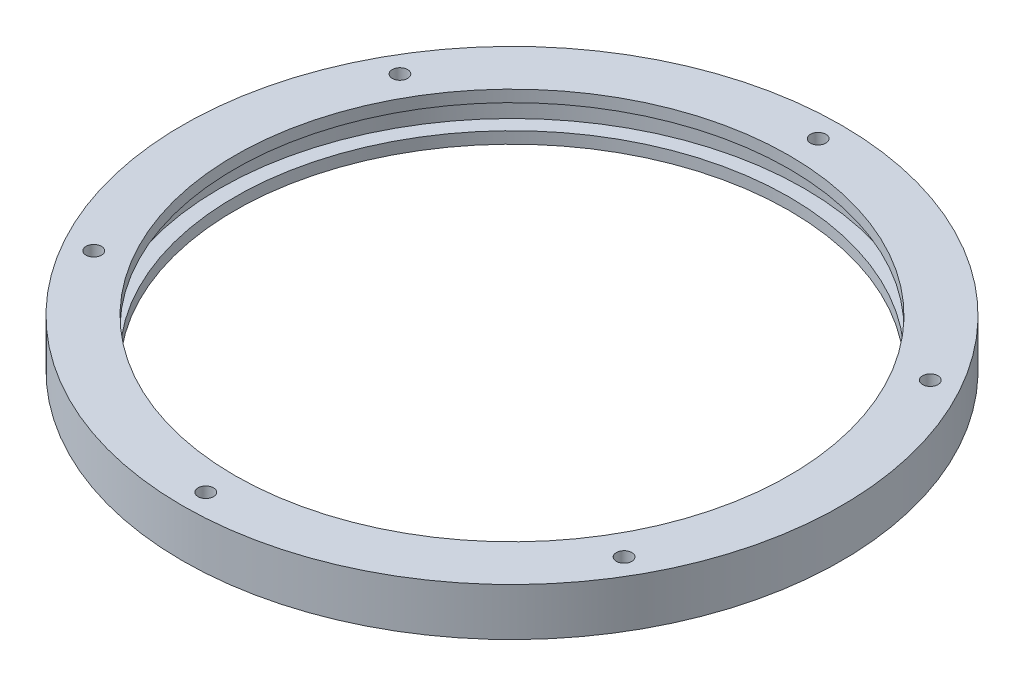
ISO-10303-21;
HEADER;
FILE_DESCRIPTION(('STEP AP214'),'2;1');
FILE_NAME('part.step','',(''),(''),'','','');
FILE_SCHEMA(('AUTOMOTIVE_DESIGN { 1 0 10303 214 1 1 1 1 }'));
ENDSEC;
DATA;
#1=APPLICATION_CONTEXT('core data for automotive mechanical design processes');
#2=APPLICATION_PROTOCOL_DEFINITION('international standard','automotive_design',2000,#1);
#3=PRODUCT_CONTEXT('',#1,'mechanical');
#4=PRODUCT('Part','Part','',(#3));
#5=PRODUCT_RELATED_PRODUCT_CATEGORY('part','',(#4));
#6=PRODUCT_DEFINITION_FORMATION('','',#4);
#7=PRODUCT_DEFINITION_CONTEXT('part definition',#1,'design');
#8=PRODUCT_DEFINITION('design','',#6,#7);
#9=PRODUCT_DEFINITION_SHAPE('','',#8);
#10=(LENGTH_UNIT() NAMED_UNIT(*) SI_UNIT(.MILLI.,.METRE.));
#11=(NAMED_UNIT(*) PLANE_ANGLE_UNIT() SI_UNIT($,.RADIAN.));
#12=(NAMED_UNIT(*) SI_UNIT($,.STERADIAN.) SOLID_ANGLE_UNIT());
#13=UNCERTAINTY_MEASURE_WITH_UNIT(LENGTH_MEASURE(1.E-05),#10,'distance_accuracy_value','');
#14=(GEOMETRIC_REPRESENTATION_CONTEXT(3) GLOBAL_UNCERTAINTY_ASSIGNED_CONTEXT((#13)) GLOBAL_UNIT_ASSIGNED_CONTEXT((#10,
#11,#12)) REPRESENTATION_CONTEXT('',''));
#15=CARTESIAN_POINT('',(0.,0.,0.));
#16=DIRECTION('',(0.,0.,1.));
#17=DIRECTION('',(1.,0.,0.));
#18=AXIS2_PLACEMENT_3D('',#15,#16,#17);
#19=CARTESIAN_POINT('',(70.5,0.,0.));
#20=DIRECTION('',(0.,-1.,0.));
#21=DIRECTION('',(0.,0.,-1.));
#22=AXIS2_PLACEMENT_3D('',#19,#20,#21);
#23=PLANE('',#22);
#24=CARTESIAN_POINT('',(0.,0.,0.));
#25=DIRECTION('',(0.,-1.,0.));
#26=DIRECTION('',(0.,0.,-1.));
#27=AXIS2_PLACEMENT_3D('',#24,#25,#26);
#28=CIRCLE('',#27,70.5);
#29=CARTESIAN_POINT('',(0.,0.,-70.5));
#30=VERTEX_POINT('',#29);
#31=EDGE_CURVE('E108',#30,#30,#28,.T.);
#32=ORIENTED_EDGE('',*,*,#31,.T.);
#33=EDGE_LOOP('',(#32));
#34=FACE_BOUND('',#33,.T.);
#35=CARTESIAN_POINT('',(0.,0.,0.));
#36=DIRECTION('',(0.,-1.,0.));
#37=DIRECTION('',(0.,0.,-1.));
#38=AXIS2_PLACEMENT_3D('',#35,#36,#37);
#39=CIRCLE('',#38,59.3);
#40=CARTESIAN_POINT('',(0.,0.,-59.3));
#41=VERTEX_POINT('',#40);
#42=EDGE_CURVE('E11',#41,#41,#39,.T.);
#43=ORIENTED_EDGE('',*,*,#42,.F.);
#44=EDGE_LOOP('',(#43));
#45=FACE_BOUND('',#44,.T.);
#46=ADVANCED_FACE('F38',(#34,#45),#23,.T.);
#47=CARTESIAN_POINT('',(0.,5.09999999999999,0.));
#48=DIRECTION('',(0.,-1.,0.));
#49=DIRECTION('',(0.,0.,-1.));
#50=AXIS2_PLACEMENT_3D('',#47,#48,#49);
#51=CYLINDRICAL_SURFACE('',#50,59.3);
#52=ORIENTED_EDGE('',*,*,#42,.T.);
#53=EDGE_LOOP('',(#52));
#54=FACE_BOUND('',#53,.T.);
#55=CARTESIAN_POINT('',(0.,2.5,0.));
#56=DIRECTION('',(0.,-1.,0.));
#57=DIRECTION('',(0.,0.,-1.));
#58=AXIS2_PLACEMENT_3D('',#55,#56,#57);
#59=CIRCLE('',#58,59.3);
#60=CARTESIAN_POINT('',(0.,2.5,-59.3));
#61=VERTEX_POINT('',#60);
#62=EDGE_CURVE('E45',#61,#61,#59,.T.);
#63=ORIENTED_EDGE('',*,*,#62,.F.);
#64=EDGE_LOOP('',(#63));
#65=FACE_BOUND('',#64,.T.);
#66=ADVANCED_FACE('F131',(#54,#65),#51,.F.);
#67=CARTESIAN_POINT('',(59.3,2.5,0.));
#68=DIRECTION('',(0.,1.,0.));
#69=DIRECTION('',(0.,0.,1.));
#70=AXIS2_PLACEMENT_3D('',#67,#68,#69);
#71=PLANE('',#70);
#72=ORIENTED_EDGE('',*,*,#62,.T.);
#73=EDGE_LOOP('',(#72));
#74=FACE_BOUND('',#73,.T.);
#75=CARTESIAN_POINT('',(0.,2.5,0.));
#76=DIRECTION('',(0.,-1.,0.));
#77=DIRECTION('',(0.,0.,-1.));
#78=AXIS2_PLACEMENT_3D('',#75,#76,#77);
#79=CIRCLE('',#78,62.5);
#80=CARTESIAN_POINT('',(0.,2.5,-62.5));
#81=VERTEX_POINT('',#80);
#82=EDGE_CURVE('E123',#81,#81,#79,.T.);
#83=ORIENTED_EDGE('',*,*,#82,.F.);
#84=EDGE_LOOP('',(#83));
#85=FACE_BOUND('',#84,.T.);
#86=ADVANCED_FACE('F128',(#74,#85),#71,.T.);
#87=CARTESIAN_POINT('',(0.,5.09999999999999,0.));
#88=DIRECTION('',(0.,-1.,0.));
#89=DIRECTION('',(0.,0.,-1.));
#90=AXIS2_PLACEMENT_3D('',#87,#88,#89);
#91=CYLINDRICAL_SURFACE('',#90,62.5);
#92=ORIENTED_EDGE('',*,*,#82,.T.);
#93=EDGE_LOOP('',(#92));
#94=FACE_BOUND('',#93,.T.);
#95=CARTESIAN_POINT('',(0.,7.7,0.));
#96=DIRECTION('',(0.,-1.,0.));
#97=DIRECTION('',(0.,0.,-1.));
#98=AXIS2_PLACEMENT_3D('',#95,#96,#97);
#99=CIRCLE('',#98,62.5);
#100=CARTESIAN_POINT('',(0.,7.7,-62.5));
#101=VERTEX_POINT('',#100);
#102=EDGE_CURVE('E120',#101,#101,#99,.T.);
#103=ORIENTED_EDGE('',*,*,#102,.F.);
#104=EDGE_LOOP('',(#103));
#105=FACE_BOUND('',#104,.T.);
#106=ADVANCED_FACE('F138',(#94,#105),#91,.F.);
#107=CARTESIAN_POINT('',(62.5,7.7,0.));
#108=DIRECTION('',(0.,-1.,0.));
#109=DIRECTION('',(0.,0.,-1.));
#110=AXIS2_PLACEMENT_3D('',#107,#108,#109);
#111=PLANE('',#110);
#112=ORIENTED_EDGE('',*,*,#102,.T.);
#113=EDGE_LOOP('',(#112));
#114=FACE_BOUND('',#113,.T.);
#115=CARTESIAN_POINT('',(0.,7.7,0.));
#116=DIRECTION('',(0.,-1.,0.));
#117=DIRECTION('',(0.,0.,-1.));
#118=AXIS2_PLACEMENT_3D('',#115,#116,#117);
#119=CIRCLE('',#118,59.3);
#120=CARTESIAN_POINT('',(0.,7.7,-59.3));
#121=VERTEX_POINT('',#120);
#122=EDGE_CURVE('E117',#121,#121,#119,.T.);
#123=ORIENTED_EDGE('',*,*,#122,.F.);
#124=EDGE_LOOP('',(#123));
#125=FACE_BOUND('',#124,.T.);
#126=ADVANCED_FACE('F144',(#114,#125),#111,.T.);
#127=CARTESIAN_POINT('',(0.,5.09999999999999,0.));
#128=DIRECTION('',(0.,-1.,0.));
#129=DIRECTION('',(0.,0.,-1.));
#130=AXIS2_PLACEMENT_3D('',#127,#128,#129);
#131=CYLINDRICAL_SURFACE('',#130,59.3);
#132=ORIENTED_EDGE('',*,*,#122,.T.);
#133=EDGE_LOOP('',(#132));
#134=FACE_BOUND('',#133,.T.);
#135=CARTESIAN_POINT('',(0.,10.2,0.));
#136=DIRECTION('',(0.,-1.,0.));
#137=DIRECTION('',(0.,0.,-1.));
#138=AXIS2_PLACEMENT_3D('',#135,#136,#137);
#139=CIRCLE('',#138,59.3);
#140=CARTESIAN_POINT('',(0.,10.2,-59.3));
#141=VERTEX_POINT('',#140);
#142=EDGE_CURVE('E114',#141,#141,#139,.T.);
#143=ORIENTED_EDGE('',*,*,#142,.F.);
#144=EDGE_LOOP('',(#143));
#145=FACE_BOUND('',#144,.T.);
#146=ADVANCED_FACE('F148',(#134,#145),#131,.F.);
#147=CARTESIAN_POINT('',(59.3,10.2,0.));
#148=DIRECTION('',(0.,1.,0.));
#149=DIRECTION('',(0.,0.,1.));
#150=AXIS2_PLACEMENT_3D('',#147,#148,#149);
#151=PLANE('',#150);
#152=CARTESIAN_POINT('',(-56.7246639478804,10.2,-32.7500000000007));
#153=DIRECTION('',(0.,1.,0.));
#154=DIRECTION('',(0.866025403784433,0.,0.50000000000001));
#155=AXIS2_PLACEMENT_3D('',#152,#153,#154);
#156=CIRCLE('',#155,1.64999999999999);
#157=CARTESIAN_POINT('',(-55.295722031636,10.2,-31.9250000000006));
#158=VERTEX_POINT('',#157);
#159=EDGE_CURVE('E91',#158,#158,#156,.T.);
#160=ORIENTED_EDGE('',*,*,#159,.F.);
#161=EDGE_LOOP('',(#160));
#162=FACE_BOUND('',#161,.T.);
#163=CARTESIAN_POINT('',(-56.724663947881,10.2,32.7499999999995));
#164=DIRECTION('',(0.,1.,0.));
#165=DIRECTION('',(0.866025403784443,0.,-0.499999999999992));
#166=AXIS2_PLACEMENT_3D('',#163,#164,#165);
#167=CIRCLE('',#166,1.64999999999999);
#168=CARTESIAN_POINT('',(-55.2957220316367,10.2,31.9249999999995));
#169=VERTEX_POINT('',#168);
#170=EDGE_CURVE('E85',#169,#169,#167,.T.);
#171=ORIENTED_EDGE('',*,*,#170,.F.);
#172=EDGE_LOOP('',(#171));
#173=FACE_BOUND('',#172,.T.);
#174=CARTESIAN_POINT('',(0.,10.2,65.5));
#175=DIRECTION('',(0.,1.,0.));
#176=DIRECTION('',(0.,0.,-1.));
#177=AXIS2_PLACEMENT_3D('',#174,#175,#176);
#178=CIRCLE('',#177,1.64999999999999);
#179=CARTESIAN_POINT('',(0.,10.2,63.85));
#180=VERTEX_POINT('',#179);
#181=EDGE_CURVE('E75',#180,#180,#178,.T.);
#182=ORIENTED_EDGE('',*,*,#181,.F.);
#183=EDGE_LOOP('',(#182));
#184=FACE_BOUND('',#183,.T.);
#185=CARTESIAN_POINT('',(56.7246639478806,10.2,32.7500000000003));
#186=DIRECTION('',(0.,1.,0.));
#187=DIRECTION('',(-0.866025403784436,0.,-0.500000000000004));
#188=AXIS2_PLACEMENT_3D('',#185,#186,#187);
#189=CIRCLE('',#188,1.64999999999999);
#190=CARTESIAN_POINT('',(55.2957220316363,10.2,31.9250000000003));
#191=VERTEX_POINT('',#190);
#192=EDGE_CURVE('E74',#191,#191,#189,.T.);
#193=ORIENTED_EDGE('',*,*,#192,.F.);
#194=EDGE_LOOP('',(#193));
#195=FACE_BOUND('',#194,.T.);
#196=CARTESIAN_POINT('',(56.7246639478808,10.2,-32.7499999999999));
#197=DIRECTION('',(0.,1.,0.));
#198=DIRECTION('',(-0.86602540378444,0.,0.499999999999998));
#199=AXIS2_PLACEMENT_3D('',#196,#197,#198);
#200=CIRCLE('',#199,1.64999999999999);
#201=CARTESIAN_POINT('',(55.2957220316365,10.2,-31.9249999999999));
#202=VERTEX_POINT('',#201);
#203=EDGE_CURVE('E96',#202,#202,#200,.T.);
#204=ORIENTED_EDGE('',*,*,#203,.F.);
#205=EDGE_LOOP('',(#204));
#206=FACE_BOUND('',#205,.T.);
#207=CARTESIAN_POINT('',(0.,10.2,-65.5));
#208=DIRECTION('',(0.,1.,0.));
#209=DIRECTION('',(0.,0.,1.));
#210=AXIS2_PLACEMENT_3D('',#207,#208,#209);
#211=CIRCLE('',#210,1.64999999999999);
#212=CARTESIAN_POINT('',(0.,10.2,-63.85));
#213=VERTEX_POINT('',#212);
#214=EDGE_CURVE('E102',#213,#213,#211,.T.);
#215=ORIENTED_EDGE('',*,*,#214,.F.);
#216=EDGE_LOOP('',(#215));
#217=FACE_BOUND('',#216,.T.);
#218=ORIENTED_EDGE('',*,*,#142,.T.);
#219=EDGE_LOOP('',(#218));
#220=FACE_BOUND('',#219,.T.);
#221=CARTESIAN_POINT('',(0.,10.2,0.));
#222=DIRECTION('',(0.,-1.,0.));
#223=DIRECTION('',(0.,0.,-1.));
#224=AXIS2_PLACEMENT_3D('',#221,#222,#223);
#225=CIRCLE('',#224,70.5);
#226=CARTESIAN_POINT('',(0.,10.2,-70.5));
#227=VERTEX_POINT('',#226);
#228=EDGE_CURVE('E111',#227,#227,#225,.T.);
#229=ORIENTED_EDGE('',*,*,#228,.F.);
#230=EDGE_LOOP('',(#229));
#231=FACE_BOUND('',#230,.T.);
#232=ADVANCED_FACE('F152',(#162,#173,#184,#195,#206,#217,#220,#231),#151,.T.);
#233=CARTESIAN_POINT('',(0.,5.09999999999999,0.));
#234=DIRECTION('',(0.,-1.,0.));
#235=DIRECTION('',(0.,0.,-1.));
#236=AXIS2_PLACEMENT_3D('',#233,#234,#235);
#237=CYLINDRICAL_SURFACE('',#236,70.5);
#238=ORIENTED_EDGE('',*,*,#228,.T.);
#239=EDGE_LOOP('',(#238));
#240=FACE_BOUND('',#239,.T.);
#241=ORIENTED_EDGE('',*,*,#31,.F.);
#242=EDGE_LOOP('',(#241));
#243=FACE_BOUND('',#242,.T.);
#244=ADVANCED_FACE('F156',(#240,#243),#237,.T.);
#245=CARTESIAN_POINT('',(0.,2.2,-65.5));
#246=DIRECTION('',(0.,1.,0.));
#247=DIRECTION('',(0.,0.,1.));
#248=AXIS2_PLACEMENT_3D('',#245,#246,#247);
#249=CONICAL_SURFACE('',#248,1.65,1.02974425867665);
#250=CARTESIAN_POINT('',(0.,1.20857997860452,-65.5));
#251=VERTEX_POINT('',#250);
#252=VERTEX_LOOP('',#251);
#253=FACE_BOUND('',#252,.T.);
#254=CARTESIAN_POINT('',(0.,2.2,-65.5));
#255=DIRECTION('',(0.,1.,0.));
#256=DIRECTION('',(0.,0.,1.));
#257=AXIS2_PLACEMENT_3D('',#254,#255,#256);
#258=CIRCLE('',#257,1.65);
#259=CARTESIAN_POINT('',(0.,2.2,-63.85));
#260=VERTEX_POINT('',#259);
#261=EDGE_CURVE('E105',#260,#260,#258,.T.);
#262=ORIENTED_EDGE('',*,*,#261,.T.);
#263=EDGE_LOOP('',(#262));
#264=FACE_BOUND('',#263,.T.);
#265=ADVANCED_FACE('F160',(#253,#264),#249,.F.);
#266=CARTESIAN_POINT('',(0.,10.2,-65.5));
#267=DIRECTION('',(0.,1.,0.));
#268=DIRECTION('',(0.,0.,1.));
#269=AXIS2_PLACEMENT_3D('',#266,#267,#268);
#270=CYLINDRICAL_SURFACE('',#269,1.64999999999999);
#271=ORIENTED_EDGE('',*,*,#261,.F.);
#272=EDGE_LOOP('',(#271));
#273=FACE_BOUND('',#272,.T.);
#274=ORIENTED_EDGE('',*,*,#214,.T.);
#275=EDGE_LOOP('',(#274));
#276=FACE_BOUND('',#275,.T.);
#277=ADVANCED_FACE('F164',(#273,#276),#270,.F.);
#278=CARTESIAN_POINT('',(56.7246639478808,2.2,-32.7499999999999));
#279=DIRECTION('',(0.,1.,0.));
#280=DIRECTION('',(-0.86602540378444,0.,0.499999999999998));
#281=AXIS2_PLACEMENT_3D('',#278,#279,#280);
#282=CONICAL_SURFACE('',#281,1.65,1.02974425867665);
#283=CARTESIAN_POINT('',(56.7246639478808,1.20857997860452,-32.7499999999999));
#284=VERTEX_POINT('',#283);
#285=VERTEX_LOOP('',#284);
#286=FACE_BOUND('',#285,.T.);
#287=CARTESIAN_POINT('',(56.7246639478808,2.2,-32.7499999999999));
#288=DIRECTION('',(0.,1.,0.));
#289=DIRECTION('',(-0.86602540378444,0.,0.499999999999998));
#290=AXIS2_PLACEMENT_3D('',#287,#288,#289);
#291=CIRCLE('',#290,1.65);
#292=CARTESIAN_POINT('',(55.2957220316365,2.2,-31.9249999999999));
#293=VERTEX_POINT('',#292);
#294=EDGE_CURVE('E99',#293,#293,#291,.T.);
#295=ORIENTED_EDGE('',*,*,#294,.T.);
#296=EDGE_LOOP('',(#295));
#297=FACE_BOUND('',#296,.T.);
#298=ADVANCED_FACE('F167',(#286,#297),#282,.F.);
#299=CARTESIAN_POINT('',(56.7246639478808,10.2,-32.7499999999999));
#300=DIRECTION('',(0.,1.,0.));
#301=DIRECTION('',(-0.86602540378444,0.,0.499999999999998));
#302=AXIS2_PLACEMENT_3D('',#299,#300,#301);
#303=CYLINDRICAL_SURFACE('',#302,1.64999999999999);
#304=ORIENTED_EDGE('',*,*,#294,.F.);
#305=EDGE_LOOP('',(#304));
#306=FACE_BOUND('',#305,.T.);
#307=ORIENTED_EDGE('',*,*,#203,.T.);
#308=EDGE_LOOP('',(#307));
#309=FACE_BOUND('',#308,.T.);
#310=ADVANCED_FACE('F171',(#306,#309),#303,.F.);
#311=CARTESIAN_POINT('',(56.7246639478806,2.2,32.7500000000003));
#312=DIRECTION('',(0.,1.,0.));
#313=DIRECTION('',(-0.866025403784436,0.,-0.500000000000004));
#314=AXIS2_PLACEMENT_3D('',#311,#312,#313);
#315=CONICAL_SURFACE('',#314,1.65,1.02974425867665);
#316=CARTESIAN_POINT('',(56.7246639478806,1.20857997860452,32.7500000000003));
#317=VERTEX_POINT('',#316);
#318=VERTEX_LOOP('',#317);
#319=FACE_BOUND('',#318,.T.);
#320=CARTESIAN_POINT('',(56.7246639478806,2.2,32.7500000000003));
#321=DIRECTION('',(0.,1.,0.));
#322=DIRECTION('',(-0.866025403784436,0.,-0.500000000000004));
#323=AXIS2_PLACEMENT_3D('',#320,#321,#322);
#324=CIRCLE('',#323,1.65);
#325=CARTESIAN_POINT('',(55.2957220316363,2.2,31.9250000000003));
#326=VERTEX_POINT('',#325);
#327=EDGE_CURVE('E78',#326,#326,#324,.T.);
#328=ORIENTED_EDGE('',*,*,#327,.T.);
#329=EDGE_LOOP('',(#328));
#330=FACE_BOUND('',#329,.T.);
#331=ADVANCED_FACE('F174',(#319,#330),#315,.F.);
#332=CARTESIAN_POINT('',(56.7246639478806,10.2,32.7500000000003));
#333=DIRECTION('',(0.,1.,0.));
#334=DIRECTION('',(-0.866025403784436,0.,-0.500000000000004));
#335=AXIS2_PLACEMENT_3D('',#332,#333,#334);
#336=CYLINDRICAL_SURFACE('',#335,1.64999999999999);
#337=ORIENTED_EDGE('',*,*,#327,.F.);
#338=EDGE_LOOP('',(#337));
#339=FACE_BOUND('',#338,.T.);
#340=ORIENTED_EDGE('',*,*,#192,.T.);
#341=EDGE_LOOP('',(#340));
#342=FACE_BOUND('',#341,.T.);
#343=ADVANCED_FACE('F68',(#339,#342),#336,.F.);
#344=CARTESIAN_POINT('',(0.,2.2,65.5));
#345=DIRECTION('',(0.,1.,0.));
#346=DIRECTION('',(0.,0.,-1.));
#347=AXIS2_PLACEMENT_3D('',#344,#345,#346);
#348=CONICAL_SURFACE('',#347,1.65,1.02974425867665);
#349=CARTESIAN_POINT('',(0.,1.20857997860452,65.5));
#350=VERTEX_POINT('',#349);
#351=VERTEX_LOOP('',#350);
#352=FACE_BOUND('',#351,.T.);
#353=CARTESIAN_POINT('',(0.,2.2,65.5));
#354=DIRECTION('',(0.,1.,0.));
#355=DIRECTION('',(0.,0.,-1.));
#356=AXIS2_PLACEMENT_3D('',#353,#354,#355);
#357=CIRCLE('',#356,1.65);
#358=CARTESIAN_POINT('',(0.,2.2,63.85));
#359=VERTEX_POINT('',#358);
#360=EDGE_CURVE('E72',#359,#359,#357,.T.);
#361=ORIENTED_EDGE('',*,*,#360,.T.);
#362=EDGE_LOOP('',(#361));
#363=FACE_BOUND('',#362,.T.);
#364=ADVANCED_FACE('F64',(#352,#363),#348,.F.);
#365=CARTESIAN_POINT('',(0.,10.2,65.5));
#366=DIRECTION('',(0.,1.,0.));
#367=DIRECTION('',(0.,0.,-1.));
#368=AXIS2_PLACEMENT_3D('',#365,#366,#367);
#369=CYLINDRICAL_SURFACE('',#368,1.64999999999999);
#370=ORIENTED_EDGE('',*,*,#360,.F.);
#371=EDGE_LOOP('',(#370));
#372=FACE_BOUND('',#371,.T.);
#373=ORIENTED_EDGE('',*,*,#181,.T.);
#374=EDGE_LOOP('',(#373));
#375=FACE_BOUND('',#374,.T.);
#376=ADVANCED_FACE('F67',(#372,#375),#369,.F.);
#377=CARTESIAN_POINT('',(-56.724663947881,2.2,32.7499999999995));
#378=DIRECTION('',(0.,1.,0.));
#379=DIRECTION('',(0.866025403784443,0.,-0.499999999999992));
#380=AXIS2_PLACEMENT_3D('',#377,#378,#379);
#381=CONICAL_SURFACE('',#380,1.65,1.02974425867665);
#382=CARTESIAN_POINT('',(-56.724663947881,1.20857997860452,32.7499999999995));
#383=VERTEX_POINT('',#382);
#384=VERTEX_LOOP('',#383);
#385=FACE_BOUND('',#384,.T.);
#386=CARTESIAN_POINT('',(-56.724663947881,2.2,32.7499999999995));
#387=DIRECTION('',(0.,1.,0.));
#388=DIRECTION('',(0.866025403784443,0.,-0.499999999999992));
#389=AXIS2_PLACEMENT_3D('',#386,#387,#388);
#390=CIRCLE('',#389,1.65);
#391=CARTESIAN_POINT('',(-55.2957220316367,2.2,31.9249999999995));
#392=VERTEX_POINT('',#391);
#393=EDGE_CURVE('E81',#392,#392,#390,.T.);
#394=ORIENTED_EDGE('',*,*,#393,.T.);
#395=EDGE_LOOP('',(#394));
#396=FACE_BOUND('',#395,.T.);
#397=ADVANCED_FACE('F185',(#385,#396),#381,.F.);
#398=CARTESIAN_POINT('',(-56.724663947881,10.2,32.7499999999995));
#399=DIRECTION('',(0.,1.,0.));
#400=DIRECTION('',(0.866025403784443,0.,-0.499999999999992));
#401=AXIS2_PLACEMENT_3D('',#398,#399,#400);
#402=CYLINDRICAL_SURFACE('',#401,1.64999999999999);
#403=ORIENTED_EDGE('',*,*,#393,.F.);
#404=EDGE_LOOP('',(#403));
#405=FACE_BOUND('',#404,.T.);
#406=ORIENTED_EDGE('',*,*,#170,.T.);
#407=EDGE_LOOP('',(#406));
#408=FACE_BOUND('',#407,.T.);
#409=ADVANCED_FACE('F180',(#405,#408),#402,.F.);
#410=CARTESIAN_POINT('',(-56.7246639478804,2.2,-32.7500000000007));
#411=DIRECTION('',(0.,1.,0.));
#412=DIRECTION('',(0.866025403784433,0.,0.50000000000001));
#413=AXIS2_PLACEMENT_3D('',#410,#411,#412);
#414=CONICAL_SURFACE('',#413,1.65,1.02974425867665);
#415=CARTESIAN_POINT('',(-56.7246639478804,1.20857997860452,-32.7500000000007));
#416=VERTEX_POINT('',#415);
#417=VERTEX_LOOP('',#416);
#418=FACE_BOUND('',#417,.T.);
#419=CARTESIAN_POINT('',(-56.7246639478804,2.2,-32.7500000000007));
#420=DIRECTION('',(0.,1.,0.));
#421=DIRECTION('',(0.866025403784433,0.,0.50000000000001));
#422=AXIS2_PLACEMENT_3D('',#419,#420,#421);
#423=CIRCLE('',#422,1.65);
#424=CARTESIAN_POINT('',(-55.295722031636,2.2,-31.9250000000006));
#425=VERTEX_POINT('',#424);
#426=EDGE_CURVE('E88',#425,#425,#423,.T.);
#427=ORIENTED_EDGE('',*,*,#426,.T.);
#428=EDGE_LOOP('',(#427));
#429=FACE_BOUND('',#428,.T.);
#430=ADVANCED_FACE('F176',(#418,#429),#414,.F.);
#431=CARTESIAN_POINT('',(-56.7246639478804,10.2,-32.7500000000007));
#432=DIRECTION('',(0.,1.,0.));
#433=DIRECTION('',(0.866025403784433,0.,0.50000000000001));
#434=AXIS2_PLACEMENT_3D('',#431,#432,#433);
#435=CYLINDRICAL_SURFACE('',#434,1.64999999999999);
#436=ORIENTED_EDGE('',*,*,#426,.F.);
#437=EDGE_LOOP('',(#436));
#438=FACE_BOUND('',#437,.T.);
#439=ORIENTED_EDGE('',*,*,#159,.T.);
#440=EDGE_LOOP('',(#439));
#441=FACE_BOUND('',#440,.T.);
#442=ADVANCED_FACE('F179',(#438,#441),#435,.F.);
#443=CLOSED_SHELL('',(#46,#66,#86,#106,#126,#146,#232,#244,#265,#277,#298,#310,#331,#343,#364,
#376,#397,#409,#430,#442));
#444=MANIFOLD_SOLID_BREP('B2',#443);
#445=ADVANCED_BREP_SHAPE_REPRESENTATION('',(#18,#444),#14);
#446=SHAPE_DEFINITION_REPRESENTATION(#9,#445);
ENDSEC;
END-ISO-10303-21;
